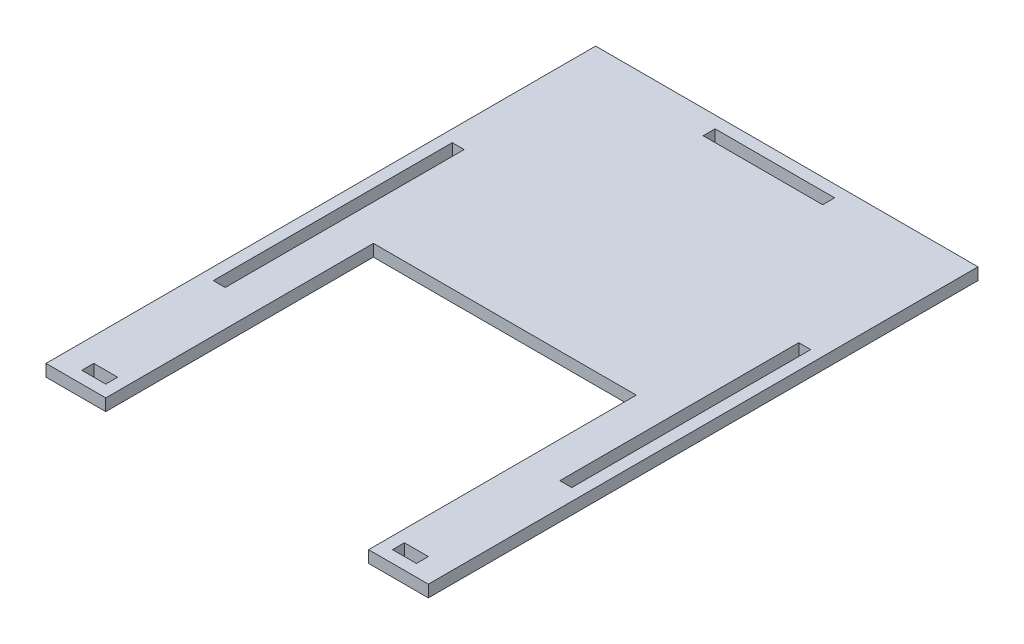
ISO-10303-21;
HEADER;
FILE_DESCRIPTION(('STEP AP214'),'2;1');
FILE_NAME('part.step','',(''),(''),'','','');
FILE_SCHEMA(('AUTOMOTIVE_DESIGN { 1 0 10303 214 1 1 1 1 }'));
ENDSEC;
DATA;
#1=APPLICATION_CONTEXT('core data for automotive mechanical design processes');
#2=APPLICATION_PROTOCOL_DEFINITION('international standard','automotive_design',2000,#1);
#3=PRODUCT_CONTEXT('',#1,'mechanical');
#4=PRODUCT('Part','Part','',(#3));
#5=PRODUCT_RELATED_PRODUCT_CATEGORY('part','',(#4));
#6=PRODUCT_DEFINITION_FORMATION('','',#4);
#7=PRODUCT_DEFINITION_CONTEXT('part definition',#1,'design');
#8=PRODUCT_DEFINITION('design','',#6,#7);
#9=PRODUCT_DEFINITION_SHAPE('','',#8);
#10=(LENGTH_UNIT() NAMED_UNIT(*) SI_UNIT(.MILLI.,.METRE.));
#11=(NAMED_UNIT(*) PLANE_ANGLE_UNIT() SI_UNIT($,.RADIAN.));
#12=(NAMED_UNIT(*) SI_UNIT($,.STERADIAN.) SOLID_ANGLE_UNIT());
#13=UNCERTAINTY_MEASURE_WITH_UNIT(LENGTH_MEASURE(1.E-05),#10,'distance_accuracy_value','');
#14=(GEOMETRIC_REPRESENTATION_CONTEXT(3) GLOBAL_UNCERTAINTY_ASSIGNED_CONTEXT((#13)) GLOBAL_UNIT_ASSIGNED_CONTEXT((#10,
#11,#12)) REPRESENTATION_CONTEXT('',''));
#15=CARTESIAN_POINT('',(0.,0.,0.));
#16=DIRECTION('',(0.,0.,1.));
#17=DIRECTION('',(1.,0.,0.));
#18=AXIS2_PLACEMENT_3D('',#15,#16,#17);
#19=CARTESIAN_POINT('',(0.,3.175,0.));
#20=DIRECTION('',(0.,1.,0.));
#21=DIRECTION('',(0.,0.,1.));
#22=AXIS2_PLACEMENT_3D('',#19,#20,#21);
#23=PLANE('',#22);
#24=DIRECTION('',(-1.,0.,0.));
#25=VECTOR('',#24,1.);
#26=CARTESIAN_POINT('',(-44.4500000000001,3.175,-31.75));
#27=LINE('',#26,#25);
#28=CARTESIAN_POINT('',(-44.4500000000001,3.175,-31.75));
#29=VERTEX_POINT('',#28);
#30=CARTESIAN_POINT('',(-47.6250000000001,3.175,-31.75));
#31=VERTEX_POINT('',#30);
#32=EDGE_CURVE('E269',#29,#31,#27,.T.);
#33=ORIENTED_EDGE('',*,*,#32,.F.);
#34=DIRECTION('',(0.,0.,-1.));
#35=VECTOR('',#34,1.);
#36=CARTESIAN_POINT('',(-44.4500000000001,3.175,-31.75));
#37=LINE('',#36,#35);
#38=CARTESIAN_POINT('',(-44.4500000000001,3.175,31.75));
#39=VERTEX_POINT('',#38);
#40=EDGE_CURVE('E267',#39,#29,#37,.T.);
#41=ORIENTED_EDGE('',*,*,#40,.F.);
#42=DIRECTION('',(1.,0.,0.));
#43=VECTOR('',#42,1.);
#44=CARTESIAN_POINT('',(-44.4500000000001,3.175,31.75));
#45=LINE('',#44,#43);
#46=CARTESIAN_POINT('',(-47.625,3.175,31.75));
#47=VERTEX_POINT('',#46);
#48=EDGE_CURVE('E275',#47,#39,#45,.T.);
#49=ORIENTED_EDGE('',*,*,#48,.F.);
#50=DIRECTION('',(0.,0.,1.));
#51=VECTOR('',#50,1.);
#52=CARTESIAN_POINT('',(-47.6250000000001,3.175,-31.75));
#53=LINE('',#52,#51);
#54=EDGE_CURVE('E272',#31,#47,#53,.T.);
#55=ORIENTED_EDGE('',*,*,#54,.F.);
#56=EDGE_LOOP('',(#33,#41,#49,#55));
#57=FACE_BOUND('',#56,.T.);
#58=DIRECTION('',(1.,0.,0.));
#59=VECTOR('',#58,1.);
#60=CARTESIAN_POINT('',(-44.45,3.175,69.85));
#61=LINE('',#60,#59);
#62=CARTESIAN_POINT('',(-44.45,3.175,69.85));
#63=VERTEX_POINT('',#62);
#64=CARTESIAN_POINT('',(-38.1,3.175,69.85));
#65=VERTEX_POINT('',#64);
#66=EDGE_CURVE('E331',#63,#65,#61,.T.);
#67=ORIENTED_EDGE('',*,*,#66,.F.);
#68=DIRECTION('',(0.,0.,1.));
#69=VECTOR('',#68,1.);
#70=CARTESIAN_POINT('',(-44.45,3.175,66.675));
#71=LINE('',#70,#69);
#72=CARTESIAN_POINT('',(-44.45,3.175,66.675));
#73=VERTEX_POINT('',#72);
#74=EDGE_CURVE('E329',#73,#63,#71,.T.);
#75=ORIENTED_EDGE('',*,*,#74,.F.);
#76=DIRECTION('',(-1.,0.,0.));
#77=VECTOR('',#76,1.);
#78=CARTESIAN_POINT('',(-44.45,3.175,66.675));
#79=LINE('',#78,#77);
#80=CARTESIAN_POINT('',(-38.1,3.175,66.675));
#81=VERTEX_POINT('',#80);
#82=EDGE_CURVE('E337',#81,#73,#79,.T.);
#83=ORIENTED_EDGE('',*,*,#82,.F.);
#84=DIRECTION('',(0.,0.,-1.));
#85=VECTOR('',#84,1.);
#86=CARTESIAN_POINT('',(-38.1,3.175,66.675));
#87=LINE('',#86,#85);
#88=EDGE_CURVE('E334',#65,#81,#87,.T.);
#89=ORIENTED_EDGE('',*,*,#88,.F.);
#90=EDGE_LOOP('',(#67,#75,#83,#89));
#91=FACE_BOUND('',#90,.T.);
#92=DIRECTION('',(0.,0.,1.));
#93=VECTOR('',#92,1.);
#94=CARTESIAN_POINT('',(-50.8,3.175,-73.025));
#95=LINE('',#94,#93);
#96=CARTESIAN_POINT('',(-50.8,3.175,-73.025));
#97=VERTEX_POINT('',#96);
#98=CARTESIAN_POINT('',(-50.8,3.175,73.025));
#99=VERTEX_POINT('',#98);
#100=EDGE_CURVE('E403',#97,#99,#95,.T.);
#101=ORIENTED_EDGE('',*,*,#100,.T.);
#102=DIRECTION('',(1.,0.,0.));
#103=VECTOR('',#102,1.);
#104=CARTESIAN_POINT('',(-50.8,3.175,73.025));
#105=LINE('',#104,#103);
#106=CARTESIAN_POINT('',(-34.925,3.175,73.025));
#107=VERTEX_POINT('',#106);
#108=EDGE_CURVE('E406',#99,#107,#105,.T.);
#109=ORIENTED_EDGE('',*,*,#108,.T.);
#110=DIRECTION('',(0.,0.,-1.));
#111=VECTOR('',#110,1.);
#112=CARTESIAN_POINT('',(-34.925,3.175,73.025));
#113=LINE('',#112,#111);
#114=CARTESIAN_POINT('',(-34.925,3.175,1.90500000000002));
#115=VERTEX_POINT('',#114);
#116=EDGE_CURVE('E409',#107,#115,#113,.T.);
#117=ORIENTED_EDGE('',*,*,#116,.T.);
#118=DIRECTION('',(1.,0.,0.));
#119=VECTOR('',#118,1.);
#120=CARTESIAN_POINT('',(-34.925,3.175,1.90500000000002));
#121=LINE('',#120,#119);
#122=CARTESIAN_POINT('',(34.925,3.175,1.90500000000001));
#123=VERTEX_POINT('',#122);
#124=EDGE_CURVE('E411',#115,#123,#121,.T.);
#125=ORIENTED_EDGE('',*,*,#124,.T.);
#126=DIRECTION('',(0.,0.,1.));
#127=VECTOR('',#126,1.);
#128=CARTESIAN_POINT('',(34.925,3.175,1.90500000000001));
#129=LINE('',#128,#127);
#130=CARTESIAN_POINT('',(34.925,3.175,73.025));
#131=VERTEX_POINT('',#130);
#132=EDGE_CURVE('E413',#123,#131,#129,.T.);
#133=ORIENTED_EDGE('',*,*,#132,.T.);
#134=DIRECTION('',(1.,0.,0.));
#135=VECTOR('',#134,1.);
#136=CARTESIAN_POINT('',(34.925,3.175,73.025));
#137=LINE('',#136,#135);
#138=CARTESIAN_POINT('',(50.8,3.175,73.025));
#139=VERTEX_POINT('',#138);
#140=EDGE_CURVE('E416',#131,#139,#137,.T.);
#141=ORIENTED_EDGE('',*,*,#140,.T.);
#142=DIRECTION('',(0.,0.,-1.));
#143=VECTOR('',#142,1.);
#144=CARTESIAN_POINT('',(50.8,3.175,-73.025));
#145=LINE('',#144,#143);
#146=CARTESIAN_POINT('',(50.8,3.175,-73.025));
#147=VERTEX_POINT('',#146);
#148=EDGE_CURVE('E419',#139,#147,#145,.T.);
#149=ORIENTED_EDGE('',*,*,#148,.T.);
#150=DIRECTION('',(-1.,0.,0.));
#151=VECTOR('',#150,1.);
#152=CARTESIAN_POINT('',(-50.8,3.175,-73.025));
#153=LINE('',#152,#151);
#154=EDGE_CURVE('E421',#147,#97,#153,.T.);
#155=ORIENTED_EDGE('',*,*,#154,.T.);
#156=EDGE_LOOP('',(#101,#109,#117,#125,#133,#141,#149,#155));
#157=FACE_BOUND('',#156,.T.);
#158=DIRECTION('',(-1.,0.,0.));
#159=VECTOR('',#158,1.);
#160=CARTESIAN_POINT('',(38.0999999999999,3.175,66.675));
#161=LINE('',#160,#159);
#162=CARTESIAN_POINT('',(44.4499999999999,3.175,66.675));
#163=VERTEX_POINT('',#162);
#164=CARTESIAN_POINT('',(38.0999999999999,3.175,66.675));
#165=VERTEX_POINT('',#164);
#166=EDGE_CURVE('E363',#163,#165,#161,.T.);
#167=ORIENTED_EDGE('',*,*,#166,.F.);
#168=DIRECTION('',(0.,0.,-1.));
#169=VECTOR('',#168,1.);
#170=CARTESIAN_POINT('',(44.4499999999999,3.175,66.675));
#171=LINE('',#170,#169);
#172=CARTESIAN_POINT('',(44.4499999999999,3.175,69.85));
#173=VERTEX_POINT('',#172);
#174=EDGE_CURVE('E360',#173,#163,#171,.T.);
#175=ORIENTED_EDGE('',*,*,#174,.F.);
#176=DIRECTION('',(1.,0.,0.));
#177=VECTOR('',#176,1.);
#178=CARTESIAN_POINT('',(38.1,3.175,69.85));
#179=LINE('',#178,#177);
#180=CARTESIAN_POINT('',(38.1,3.175,69.85));
#181=VERTEX_POINT('',#180);
#182=EDGE_CURVE('E371',#181,#173,#179,.T.);
#183=ORIENTED_EDGE('',*,*,#182,.F.);
#184=DIRECTION('',(0.,0.,1.));
#185=VECTOR('',#184,1.);
#186=CARTESIAN_POINT('',(38.0999999999999,3.175,66.675));
#187=LINE('',#186,#185);
#188=EDGE_CURVE('E367',#165,#181,#187,.T.);
#189=ORIENTED_EDGE('',*,*,#188,.F.);
#190=EDGE_LOOP('',(#167,#175,#183,#189));
#191=FACE_BOUND('',#190,.T.);
#192=DIRECTION('',(1.,0.,0.));
#193=VECTOR('',#192,1.);
#194=CARTESIAN_POINT('',(-15.875,3.175,-66.675));
#195=LINE('',#194,#193);
#196=CARTESIAN_POINT('',(-15.875,3.175,-66.675));
#197=VERTEX_POINT('',#196);
#198=CARTESIAN_POINT('',(15.875,3.175,-66.675));
#199=VERTEX_POINT('',#198);
#200=EDGE_CURVE('E300',#197,#199,#195,.T.);
#201=ORIENTED_EDGE('',*,*,#200,.F.);
#202=DIRECTION('',(0.,0.,1.));
#203=VECTOR('',#202,1.);
#204=CARTESIAN_POINT('',(-15.875,3.175,-69.85));
#205=LINE('',#204,#203);
#206=CARTESIAN_POINT('',(-15.875,3.175,-69.85));
#207=VERTEX_POINT('',#206);
#208=EDGE_CURVE('E298',#207,#197,#205,.T.);
#209=ORIENTED_EDGE('',*,*,#208,.F.);
#210=DIRECTION('',(-1.,0.,0.));
#211=VECTOR('',#210,1.);
#212=CARTESIAN_POINT('',(-15.875,3.175,-69.85));
#213=LINE('',#212,#211);
#214=CARTESIAN_POINT('',(15.875,3.175,-69.85));
#215=VERTEX_POINT('',#214);
#216=EDGE_CURVE('E306',#215,#207,#213,.T.);
#217=ORIENTED_EDGE('',*,*,#216,.F.);
#218=DIRECTION('',(0.,0.,-1.));
#219=VECTOR('',#218,1.);
#220=CARTESIAN_POINT('',(15.875,3.175,-69.85));
#221=LINE('',#220,#219);
#222=EDGE_CURVE('E303',#199,#215,#221,.T.);
#223=ORIENTED_EDGE('',*,*,#222,.F.);
#224=EDGE_LOOP('',(#201,#209,#217,#223));
#225=FACE_BOUND('',#224,.T.);
#226=DIRECTION('',(1.,0.,0.));
#227=VECTOR('',#226,1.);
#228=CARTESIAN_POINT('',(44.4499999999999,3.175,31.75));
#229=LINE('',#228,#227);
#230=CARTESIAN_POINT('',(44.4499999999999,3.175,31.75));
#231=VERTEX_POINT('',#230);
#232=CARTESIAN_POINT('',(47.625,3.175,31.75));
#233=VERTEX_POINT('',#232);
#234=EDGE_CURVE('E239',#231,#233,#229,.T.);
#235=ORIENTED_EDGE('',*,*,#234,.F.);
#236=DIRECTION('',(0.,0.,1.));
#237=VECTOR('',#236,1.);
#238=CARTESIAN_POINT('',(44.4499999999999,3.175,-31.75));
#239=LINE('',#238,#237);
#240=CARTESIAN_POINT('',(44.4499999999999,3.175,-31.75));
#241=VERTEX_POINT('',#240);
#242=EDGE_CURVE('E231',#241,#231,#239,.T.);
#243=ORIENTED_EDGE('',*,*,#242,.F.);
#244=DIRECTION('',(-1.,0.,0.));
#245=VECTOR('',#244,1.);
#246=CARTESIAN_POINT('',(44.4499999999999,3.175,-31.75));
#247=LINE('',#246,#245);
#248=CARTESIAN_POINT('',(47.625,3.175,-31.75));
#249=VERTEX_POINT('',#248);
#250=EDGE_CURVE('E253',#249,#241,#247,.T.);
#251=ORIENTED_EDGE('',*,*,#250,.F.);
#252=DIRECTION('',(0.,0.,-1.));
#253=VECTOR('',#252,1.);
#254=CARTESIAN_POINT('',(47.625,3.175,-31.75));
#255=LINE('',#254,#253);
#256=EDGE_CURVE('E251',#233,#249,#255,.T.);
#257=ORIENTED_EDGE('',*,*,#256,.F.);
#258=EDGE_LOOP('',(#235,#243,#251,#257));
#259=FACE_BOUND('',#258,.T.);
#260=ADVANCED_FACE('F36',(#57,#91,#157,#191,#225,#259),#23,.T.);
#261=CARTESIAN_POINT('',(0.,0.,0.));
#262=DIRECTION('',(0.,1.,0.));
#263=DIRECTION('',(0.,0.,1.));
#264=AXIS2_PLACEMENT_3D('',#261,#262,#263);
#265=PLANE('',#264);
#266=DIRECTION('',(0.,0.,-1.));
#267=VECTOR('',#266,1.);
#268=CARTESIAN_POINT('',(-44.4500000000001,0.,-31.75));
#269=LINE('',#268,#267);
#270=CARTESIAN_POINT('',(-44.4500000000001,0.,31.75));
#271=VERTEX_POINT('',#270);
#272=CARTESIAN_POINT('',(-44.4500000000001,0.,-31.75));
#273=VERTEX_POINT('',#272);
#274=EDGE_CURVE('E247',#271,#273,#269,.T.);
#275=ORIENTED_EDGE('',*,*,#274,.T.);
#276=DIRECTION('',(-1.,0.,0.));
#277=VECTOR('',#276,1.);
#278=CARTESIAN_POINT('',(-44.4500000000001,0.,-31.75));
#279=LINE('',#278,#277);
#280=CARTESIAN_POINT('',(-47.6250000000001,0.,-31.75));
#281=VERTEX_POINT('',#280);
#282=EDGE_CURVE('E280',#273,#281,#279,.T.);
#283=ORIENTED_EDGE('',*,*,#282,.T.);
#284=DIRECTION('',(0.,0.,1.));
#285=VECTOR('',#284,1.);
#286=CARTESIAN_POINT('',(-47.6250000000001,0.,-31.75));
#287=LINE('',#286,#285);
#288=CARTESIAN_POINT('',(-47.625,0.,31.75));
#289=VERTEX_POINT('',#288);
#290=EDGE_CURVE('E283',#281,#289,#287,.T.);
#291=ORIENTED_EDGE('',*,*,#290,.T.);
#292=DIRECTION('',(1.,0.,0.));
#293=VECTOR('',#292,1.);
#294=CARTESIAN_POINT('',(-44.4500000000001,0.,31.75));
#295=LINE('',#294,#293);
#296=EDGE_CURVE('E270',#289,#271,#295,.T.);
#297=ORIENTED_EDGE('',*,*,#296,.T.);
#298=EDGE_LOOP('',(#275,#283,#291,#297));
#299=FACE_BOUND('',#298,.T.);
#300=DIRECTION('',(0.,0.,1.));
#301=VECTOR('',#300,1.);
#302=CARTESIAN_POINT('',(-44.45,0.,66.675));
#303=LINE('',#302,#301);
#304=CARTESIAN_POINT('',(-44.45,0.,66.675));
#305=VERTEX_POINT('',#304);
#306=CARTESIAN_POINT('',(-44.45,0.,69.85));
#307=VERTEX_POINT('',#306);
#308=EDGE_CURVE('E328',#305,#307,#303,.T.);
#309=ORIENTED_EDGE('',*,*,#308,.T.);
#310=DIRECTION('',(1.,0.,0.));
#311=VECTOR('',#310,1.);
#312=CARTESIAN_POINT('',(-44.45,0.,69.85));
#313=LINE('',#312,#311);
#314=CARTESIAN_POINT('',(-38.1,0.,69.85));
#315=VERTEX_POINT('',#314);
#316=EDGE_CURVE('E342',#307,#315,#313,.T.);
#317=ORIENTED_EDGE('',*,*,#316,.T.);
#318=DIRECTION('',(0.,0.,-1.));
#319=VECTOR('',#318,1.);
#320=CARTESIAN_POINT('',(-38.1,0.,66.675));
#321=LINE('',#320,#319);
#322=CARTESIAN_POINT('',(-38.1,0.,66.675));
#323=VERTEX_POINT('',#322);
#324=EDGE_CURVE('E345',#315,#323,#321,.T.);
#325=ORIENTED_EDGE('',*,*,#324,.T.);
#326=DIRECTION('',(-1.,0.,0.));
#327=VECTOR('',#326,1.);
#328=CARTESIAN_POINT('',(-44.45,0.,66.675));
#329=LINE('',#328,#327);
#330=EDGE_CURVE('E332',#323,#305,#329,.T.);
#331=ORIENTED_EDGE('',*,*,#330,.T.);
#332=EDGE_LOOP('',(#309,#317,#325,#331));
#333=FACE_BOUND('',#332,.T.);
#334=DIRECTION('',(0.,0.,1.));
#335=VECTOR('',#334,1.);
#336=CARTESIAN_POINT('',(-50.8,0.,-73.025));
#337=LINE('',#336,#335);
#338=CARTESIAN_POINT('',(-50.8,0.,-73.025));
#339=VERTEX_POINT('',#338);
#340=CARTESIAN_POINT('',(-50.8,0.,73.025));
#341=VERTEX_POINT('',#340);
#342=EDGE_CURVE('E402',#339,#341,#337,.T.);
#343=ORIENTED_EDGE('',*,*,#342,.F.);
#344=DIRECTION('',(-1.,0.,0.));
#345=VECTOR('',#344,1.);
#346=CARTESIAN_POINT('',(-50.8,0.,-73.025));
#347=LINE('',#346,#345);
#348=CARTESIAN_POINT('',(50.8,0.,-73.025));
#349=VERTEX_POINT('',#348);
#350=EDGE_CURVE('E407',#349,#339,#347,.T.);
#351=ORIENTED_EDGE('',*,*,#350,.F.);
#352=DIRECTION('',(0.,0.,-1.));
#353=VECTOR('',#352,1.);
#354=CARTESIAN_POINT('',(50.8,0.,-73.025));
#355=LINE('',#354,#353);
#356=CARTESIAN_POINT('',(50.8,0.,73.025));
#357=VERTEX_POINT('',#356);
#358=EDGE_CURVE('E438',#357,#349,#355,.T.);
#359=ORIENTED_EDGE('',*,*,#358,.F.);
#360=DIRECTION('',(1.,0.,0.));
#361=VECTOR('',#360,1.);
#362=CARTESIAN_POINT('',(34.925,0.,73.025));
#363=LINE('',#362,#361);
#364=CARTESIAN_POINT('',(34.925,0.,73.025));
#365=VERTEX_POINT('',#364);
#366=EDGE_CURVE('E435',#365,#357,#363,.T.);
#367=ORIENTED_EDGE('',*,*,#366,.F.);
#368=DIRECTION('',(0.,0.,1.));
#369=VECTOR('',#368,1.);
#370=CARTESIAN_POINT('',(34.925,0.,1.90500000000001));
#371=LINE('',#370,#369);
#372=CARTESIAN_POINT('',(34.925,0.,1.90500000000001));
#373=VERTEX_POINT('',#372);
#374=EDGE_CURVE('E432',#373,#365,#371,.T.);
#375=ORIENTED_EDGE('',*,*,#374,.F.);
#376=DIRECTION('',(1.,0.,0.));
#377=VECTOR('',#376,1.);
#378=CARTESIAN_POINT('',(-34.925,0.,1.90500000000002));
#379=LINE('',#378,#377);
#380=CARTESIAN_POINT('',(-34.925,0.,1.90500000000002));
#381=VERTEX_POINT('',#380);
#382=EDGE_CURVE('E430',#381,#373,#379,.T.);
#383=ORIENTED_EDGE('',*,*,#382,.F.);
#384=DIRECTION('',(0.,0.,-1.));
#385=VECTOR('',#384,1.);
#386=CARTESIAN_POINT('',(-34.925,0.,73.025));
#387=LINE('',#386,#385);
#388=CARTESIAN_POINT('',(-34.925,0.,73.025));
#389=VERTEX_POINT('',#388);
#390=EDGE_CURVE('E428',#389,#381,#387,.T.);
#391=ORIENTED_EDGE('',*,*,#390,.F.);
#392=DIRECTION('',(1.,0.,0.));
#393=VECTOR('',#392,1.);
#394=CARTESIAN_POINT('',(-50.8,0.,73.025));
#395=LINE('',#394,#393);
#396=EDGE_CURVE('E426',#341,#389,#395,.T.);
#397=ORIENTED_EDGE('',*,*,#396,.F.);
#398=EDGE_LOOP('',(#343,#351,#359,#367,#375,#383,#391,#397));
#399=FACE_BOUND('',#398,.T.);
#400=DIRECTION('',(0.,0.,-1.));
#401=VECTOR('',#400,1.);
#402=CARTESIAN_POINT('',(44.4499999999999,0.,66.675));
#403=LINE('',#402,#401);
#404=CARTESIAN_POINT('',(44.4499999999999,0.,69.85));
#405=VERTEX_POINT('',#404);
#406=CARTESIAN_POINT('',(44.4499999999999,0.,66.675));
#407=VERTEX_POINT('',#406);
#408=EDGE_CURVE('E359',#405,#407,#403,.T.);
#409=ORIENTED_EDGE('',*,*,#408,.T.);
#410=DIRECTION('',(-1.,0.,0.));
#411=VECTOR('',#410,1.);
#412=CARTESIAN_POINT('',(38.0999999999999,0.,66.675));
#413=LINE('',#412,#411);
#414=CARTESIAN_POINT('',(38.0999999999999,0.,66.675));
#415=VERTEX_POINT('',#414);
#416=EDGE_CURVE('E378',#407,#415,#413,.T.);
#417=ORIENTED_EDGE('',*,*,#416,.T.);
#418=DIRECTION('',(0.,0.,1.));
#419=VECTOR('',#418,1.);
#420=CARTESIAN_POINT('',(38.0999999999999,0.,66.675));
#421=LINE('',#420,#419);
#422=CARTESIAN_POINT('',(38.1,0.,69.85));
#423=VERTEX_POINT('',#422);
#424=EDGE_CURVE('E382',#415,#423,#421,.T.);
#425=ORIENTED_EDGE('',*,*,#424,.T.);
#426=DIRECTION('',(1.,0.,0.));
#427=VECTOR('',#426,1.);
#428=CARTESIAN_POINT('',(38.1,0.,69.85));
#429=LINE('',#428,#427);
#430=EDGE_CURVE('E364',#423,#405,#429,.T.);
#431=ORIENTED_EDGE('',*,*,#430,.T.);
#432=EDGE_LOOP('',(#409,#417,#425,#431));
#433=FACE_BOUND('',#432,.T.);
#434=DIRECTION('',(0.,0.,1.));
#435=VECTOR('',#434,1.);
#436=CARTESIAN_POINT('',(-15.875,0.,-69.85));
#437=LINE('',#436,#435);
#438=CARTESIAN_POINT('',(-15.875,0.,-69.85));
#439=VERTEX_POINT('',#438);
#440=CARTESIAN_POINT('',(-15.875,0.,-66.675));
#441=VERTEX_POINT('',#440);
#442=EDGE_CURVE('E297',#439,#441,#437,.T.);
#443=ORIENTED_EDGE('',*,*,#442,.T.);
#444=DIRECTION('',(1.,0.,0.));
#445=VECTOR('',#444,1.);
#446=CARTESIAN_POINT('',(-15.875,0.,-66.675));
#447=LINE('',#446,#445);
#448=CARTESIAN_POINT('',(15.875,0.,-66.675));
#449=VERTEX_POINT('',#448);
#450=EDGE_CURVE('E311',#441,#449,#447,.T.);
#451=ORIENTED_EDGE('',*,*,#450,.T.);
#452=DIRECTION('',(0.,0.,-1.));
#453=VECTOR('',#452,1.);
#454=CARTESIAN_POINT('',(15.875,0.,-69.85));
#455=LINE('',#454,#453);
#456=CARTESIAN_POINT('',(15.875,0.,-69.85));
#457=VERTEX_POINT('',#456);
#458=EDGE_CURVE('E314',#449,#457,#455,.T.);
#459=ORIENTED_EDGE('',*,*,#458,.T.);
#460=DIRECTION('',(-1.,0.,0.));
#461=VECTOR('',#460,1.);
#462=CARTESIAN_POINT('',(-15.875,0.,-69.85));
#463=LINE('',#462,#461);
#464=EDGE_CURVE('E301',#457,#439,#463,.T.);
#465=ORIENTED_EDGE('',*,*,#464,.T.);
#466=EDGE_LOOP('',(#443,#451,#459,#465));
#467=FACE_BOUND('',#466,.T.);
#468=DIRECTION('',(0.,0.,1.));
#469=VECTOR('',#468,1.);
#470=CARTESIAN_POINT('',(44.4499999999999,0.,-31.75));
#471=LINE('',#470,#469);
#472=CARTESIAN_POINT('',(44.4499999999999,0.,-31.75));
#473=VERTEX_POINT('',#472);
#474=CARTESIAN_POINT('',(44.4499999999999,0.,31.75));
#475=VERTEX_POINT('',#474);
#476=EDGE_CURVE('E59',#473,#475,#471,.T.);
#477=ORIENTED_EDGE('',*,*,#476,.T.);
#478=DIRECTION('',(1.,0.,0.));
#479=VECTOR('',#478,1.);
#480=CARTESIAN_POINT('',(44.4499999999999,0.,31.75));
#481=LINE('',#480,#479);
#482=CARTESIAN_POINT('',(47.625,0.,31.75));
#483=VERTEX_POINT('',#482);
#484=EDGE_CURVE('E246',#475,#483,#481,.T.);
#485=ORIENTED_EDGE('',*,*,#484,.T.);
#486=DIRECTION('',(0.,0.,-1.));
#487=VECTOR('',#486,1.);
#488=CARTESIAN_POINT('',(47.625,0.,-31.75));
#489=LINE('',#488,#487);
#490=CARTESIAN_POINT('',(47.625,0.,-31.75));
#491=VERTEX_POINT('',#490);
#492=EDGE_CURVE('E259',#483,#491,#489,.T.);
#493=ORIENTED_EDGE('',*,*,#492,.T.);
#494=DIRECTION('',(-1.,0.,0.));
#495=VECTOR('',#494,1.);
#496=CARTESIAN_POINT('',(44.4499999999999,0.,-31.75));
#497=LINE('',#496,#495);
#498=EDGE_CURVE('E240',#491,#473,#497,.T.);
#499=ORIENTED_EDGE('',*,*,#498,.T.);
#500=EDGE_LOOP('',(#477,#485,#493,#499));
#501=FACE_BOUND('',#500,.T.);
#502=ADVANCED_FACE('F469',(#299,#333,#399,#433,#467,#501),#265,.F.);
#503=CARTESIAN_POINT('',(-50.8,3.175,-73.025));
#504=DIRECTION('',(1.,0.,0.));
#505=DIRECTION('',(0.,0.,-1.));
#506=AXIS2_PLACEMENT_3D('',#503,#504,#505);
#507=PLANE('',#506);
#508=ORIENTED_EDGE('',*,*,#342,.T.);
#509=DIRECTION('',(0.,-1.,0.));
#510=VECTOR('',#509,1.);
#511=CARTESIAN_POINT('',(-50.8,3.175,73.025));
#512=LINE('',#511,#510);
#513=EDGE_CURVE('E11',#99,#341,#512,.T.);
#514=ORIENTED_EDGE('',*,*,#513,.F.);
#515=ORIENTED_EDGE('',*,*,#100,.F.);
#516=DIRECTION('',(0.,-1.,0.));
#517=VECTOR('',#516,1.);
#518=CARTESIAN_POINT('',(-50.8,3.175,-73.025));
#519=LINE('',#518,#517);
#520=EDGE_CURVE('E423',#97,#339,#519,.T.);
#521=ORIENTED_EDGE('',*,*,#520,.T.);
#522=EDGE_LOOP('',(#508,#514,#515,#521));
#523=FACE_BOUND('',#522,.T.);
#524=ADVANCED_FACE('F38',(#523),#507,.F.);
#525=CARTESIAN_POINT('',(-50.8,3.175,73.025));
#526=DIRECTION('',(0.,0.,-1.));
#527=DIRECTION('',(-1.,0.,0.));
#528=AXIS2_PLACEMENT_3D('',#525,#526,#527);
#529=PLANE('',#528);
#530=ORIENTED_EDGE('',*,*,#396,.T.);
#531=DIRECTION('',(0.,-1.,0.));
#532=VECTOR('',#531,1.);
#533=CARTESIAN_POINT('',(-34.925,3.175,73.025));
#534=LINE('',#533,#532);
#535=EDGE_CURVE('E44',#107,#389,#534,.T.);
#536=ORIENTED_EDGE('',*,*,#535,.F.);
#537=ORIENTED_EDGE('',*,*,#108,.F.);
#538=ORIENTED_EDGE('',*,*,#513,.T.);
#539=EDGE_LOOP('',(#530,#536,#537,#538));
#540=FACE_BOUND('',#539,.T.);
#541=ADVANCED_FACE('F487',(#540),#529,.F.);
#542=CARTESIAN_POINT('',(-34.925,3.175,73.025));
#543=DIRECTION('',(-1.,0.,0.));
#544=DIRECTION('',(0.,0.,1.));
#545=AXIS2_PLACEMENT_3D('',#542,#543,#544);
#546=PLANE('',#545);
#547=ORIENTED_EDGE('',*,*,#390,.T.);
#548=DIRECTION('',(0.,-1.,0.));
#549=VECTOR('',#548,1.);
#550=CARTESIAN_POINT('',(-34.925,3.175,1.90500000000002));
#551=LINE('',#550,#549);
#552=EDGE_CURVE('E456',#115,#381,#551,.T.);
#553=ORIENTED_EDGE('',*,*,#552,.F.);
#554=ORIENTED_EDGE('',*,*,#116,.F.);
#555=ORIENTED_EDGE('',*,*,#535,.T.);
#556=EDGE_LOOP('',(#547,#553,#554,#555));
#557=FACE_BOUND('',#556,.T.);
#558=ADVANCED_FACE('F463',(#557),#546,.F.);
#559=CARTESIAN_POINT('',(-34.925,3.175,1.90500000000002));
#560=DIRECTION('',(0.,0.,-1.));
#561=DIRECTION('',(-1.,0.,0.));
#562=AXIS2_PLACEMENT_3D('',#559,#560,#561);
#563=PLANE('',#562);
#564=ORIENTED_EDGE('',*,*,#382,.T.);
#565=DIRECTION('',(0.,-1.,0.));
#566=VECTOR('',#565,1.);
#567=CARTESIAN_POINT('',(34.925,3.175,1.90500000000001));
#568=LINE('',#567,#566);
#569=EDGE_CURVE('E453',#123,#373,#568,.T.);
#570=ORIENTED_EDGE('',*,*,#569,.F.);
#571=ORIENTED_EDGE('',*,*,#124,.F.);
#572=ORIENTED_EDGE('',*,*,#552,.T.);
#573=EDGE_LOOP('',(#564,#570,#571,#572));
#574=FACE_BOUND('',#573,.T.);
#575=ADVANCED_FACE('F475',(#574),#563,.F.);
#576=CARTESIAN_POINT('',(34.925,3.175,1.90500000000001));
#577=DIRECTION('',(1.,0.,0.));
#578=DIRECTION('',(0.,0.,-1.));
#579=AXIS2_PLACEMENT_3D('',#576,#577,#578);
#580=PLANE('',#579);
#581=ORIENTED_EDGE('',*,*,#374,.T.);
#582=DIRECTION('',(0.,-1.,0.));
#583=VECTOR('',#582,1.);
#584=CARTESIAN_POINT('',(34.925,3.175,73.025));
#585=LINE('',#584,#583);
#586=EDGE_CURVE('E449',#131,#365,#585,.T.);
#587=ORIENTED_EDGE('',*,*,#586,.F.);
#588=ORIENTED_EDGE('',*,*,#132,.F.);
#589=ORIENTED_EDGE('',*,*,#569,.T.);
#590=EDGE_LOOP('',(#581,#587,#588,#589));
#591=FACE_BOUND('',#590,.T.);
#592=ADVANCED_FACE('F479',(#591),#580,.F.);
#593=CARTESIAN_POINT('',(34.925,3.175,73.025));
#594=DIRECTION('',(0.,0.,-1.));
#595=DIRECTION('',(-1.,0.,0.));
#596=AXIS2_PLACEMENT_3D('',#593,#594,#595);
#597=PLANE('',#596);
#598=ORIENTED_EDGE('',*,*,#366,.T.);
#599=DIRECTION('',(0.,-1.,0.));
#600=VECTOR('',#599,1.);
#601=CARTESIAN_POINT('',(50.8,3.175,73.025));
#602=LINE('',#601,#600);
#603=EDGE_CURVE('E446',#139,#357,#602,.T.);
#604=ORIENTED_EDGE('',*,*,#603,.F.);
#605=ORIENTED_EDGE('',*,*,#140,.F.);
#606=ORIENTED_EDGE('',*,*,#586,.T.);
#607=EDGE_LOOP('',(#598,#604,#605,#606));
#608=FACE_BOUND('',#607,.T.);
#609=ADVANCED_FACE('F500',(#608),#597,.F.);
#610=CARTESIAN_POINT('',(50.8,3.175,-73.025));
#611=DIRECTION('',(-1.,0.,0.));
#612=DIRECTION('',(0.,0.,1.));
#613=AXIS2_PLACEMENT_3D('',#610,#611,#612);
#614=PLANE('',#613);
#615=ORIENTED_EDGE('',*,*,#358,.T.);
#616=DIRECTION('',(0.,-1.,0.));
#617=VECTOR('',#616,1.);
#618=CARTESIAN_POINT('',(50.8,3.175,-73.025));
#619=LINE('',#618,#617);
#620=EDGE_CURVE('E443',#147,#349,#619,.T.);
#621=ORIENTED_EDGE('',*,*,#620,.F.);
#622=ORIENTED_EDGE('',*,*,#148,.F.);
#623=ORIENTED_EDGE('',*,*,#603,.T.);
#624=EDGE_LOOP('',(#615,#621,#622,#623));
#625=FACE_BOUND('',#624,.T.);
#626=ADVANCED_FACE('F498',(#625),#614,.F.);
#627=CARTESIAN_POINT('',(-50.8,3.175,-73.025));
#628=DIRECTION('',(0.,0.,1.));
#629=DIRECTION('',(1.,0.,0.));
#630=AXIS2_PLACEMENT_3D('',#627,#628,#629);
#631=PLANE('',#630);
#632=ORIENTED_EDGE('',*,*,#350,.T.);
#633=ORIENTED_EDGE('',*,*,#520,.F.);
#634=ORIENTED_EDGE('',*,*,#154,.F.);
#635=ORIENTED_EDGE('',*,*,#620,.T.);
#636=EDGE_LOOP('',(#632,#633,#634,#635));
#637=FACE_BOUND('',#636,.T.);
#638=ADVANCED_FACE('F493',(#637),#631,.F.);
#639=CARTESIAN_POINT('',(44.4499999999999,3.175,66.675));
#640=DIRECTION('',(-1.,0.,0.));
#641=DIRECTION('',(0.,0.,1.));
#642=AXIS2_PLACEMENT_3D('',#639,#640,#641);
#643=PLANE('',#642);
#644=ORIENTED_EDGE('',*,*,#408,.F.);
#645=DIRECTION('',(0.,-1.,0.));
#646=VECTOR('',#645,1.);
#647=CARTESIAN_POINT('',(44.4499999999999,3.175,69.85));
#648=LINE('',#647,#646);
#649=EDGE_CURVE('E374',#173,#405,#648,.T.);
#650=ORIENTED_EDGE('',*,*,#649,.F.);
#651=ORIENTED_EDGE('',*,*,#174,.T.);
#652=DIRECTION('',(0.,-1.,0.));
#653=VECTOR('',#652,1.);
#654=CARTESIAN_POINT('',(44.4499999999999,3.175,66.675));
#655=LINE('',#654,#653);
#656=EDGE_CURVE('E398',#163,#407,#655,.T.);
#657=ORIENTED_EDGE('',*,*,#656,.T.);
#658=EDGE_LOOP('',(#644,#650,#651,#657));
#659=FACE_BOUND('',#658,.T.);
#660=ADVANCED_FACE('F520',(#659),#643,.T.);
#661=CARTESIAN_POINT('',(38.0999999999999,3.175,66.675));
#662=DIRECTION('',(0.,0.,1.));
#663=DIRECTION('',(1.,0.,0.));
#664=AXIS2_PLACEMENT_3D('',#661,#662,#663);
#665=PLANE('',#664);
#666=ORIENTED_EDGE('',*,*,#416,.F.);
#667=ORIENTED_EDGE('',*,*,#656,.F.);
#668=ORIENTED_EDGE('',*,*,#166,.T.);
#669=DIRECTION('',(0.,-1.,0.));
#670=VECTOR('',#669,1.);
#671=CARTESIAN_POINT('',(38.0999999999999,3.175,66.675));
#672=LINE('',#671,#670);
#673=EDGE_CURVE('E395',#165,#415,#672,.T.);
#674=ORIENTED_EDGE('',*,*,#673,.T.);
#675=EDGE_LOOP('',(#666,#667,#668,#674));
#676=FACE_BOUND('',#675,.T.);
#677=ADVANCED_FACE('F527',(#676),#665,.T.);
#678=CARTESIAN_POINT('',(38.0999999999999,3.175,66.675));
#679=DIRECTION('',(1.,0.,0.));
#680=DIRECTION('',(0.,0.,-1.));
#681=AXIS2_PLACEMENT_3D('',#678,#679,#680);
#682=PLANE('',#681);
#683=ORIENTED_EDGE('',*,*,#424,.F.);
#684=ORIENTED_EDGE('',*,*,#673,.F.);
#685=ORIENTED_EDGE('',*,*,#188,.T.);
#686=DIRECTION('',(0.,-1.,0.));
#687=VECTOR('',#686,1.);
#688=CARTESIAN_POINT('',(38.1,3.175,69.85));
#689=LINE('',#688,#687);
#690=EDGE_CURVE('E392',#181,#423,#689,.T.);
#691=ORIENTED_EDGE('',*,*,#690,.T.);
#692=EDGE_LOOP('',(#683,#684,#685,#691));
#693=FACE_BOUND('',#692,.T.);
#694=ADVANCED_FACE('F532',(#693),#682,.T.);
#695=CARTESIAN_POINT('',(38.1,3.175,69.85));
#696=DIRECTION('',(0.,0.,-1.));
#697=DIRECTION('',(-1.,0.,0.));
#698=AXIS2_PLACEMENT_3D('',#695,#696,#697);
#699=PLANE('',#698);
#700=ORIENTED_EDGE('',*,*,#430,.F.);
#701=ORIENTED_EDGE('',*,*,#690,.F.);
#702=ORIENTED_EDGE('',*,*,#182,.T.);
#703=ORIENTED_EDGE('',*,*,#649,.T.);
#704=EDGE_LOOP('',(#700,#701,#702,#703));
#705=FACE_BOUND('',#704,.T.);
#706=ADVANCED_FACE('F539',(#705),#699,.T.);
#707=CARTESIAN_POINT('',(-44.45,3.175,66.675));
#708=DIRECTION('',(1.,0.,0.));
#709=DIRECTION('',(0.,0.,-1.));
#710=AXIS2_PLACEMENT_3D('',#707,#708,#709);
#711=PLANE('',#710);
#712=ORIENTED_EDGE('',*,*,#308,.F.);
#713=DIRECTION('',(0.,-1.,0.));
#714=VECTOR('',#713,1.);
#715=CARTESIAN_POINT('',(-44.45,3.175,66.675));
#716=LINE('',#715,#714);
#717=EDGE_CURVE('E339',#73,#305,#716,.T.);
#718=ORIENTED_EDGE('',*,*,#717,.F.);
#719=ORIENTED_EDGE('',*,*,#74,.T.);
#720=DIRECTION('',(0.,-1.,0.));
#721=VECTOR('',#720,1.);
#722=CARTESIAN_POINT('',(-44.45,3.175,69.85));
#723=LINE('',#722,#721);
#724=EDGE_CURVE('E356',#63,#307,#723,.T.);
#725=ORIENTED_EDGE('',*,*,#724,.T.);
#726=EDGE_LOOP('',(#712,#718,#719,#725));
#727=FACE_BOUND('',#726,.T.);
#728=ADVANCED_FACE('F594',(#727),#711,.T.);
#729=CARTESIAN_POINT('',(-44.45,3.175,69.85));
#730=DIRECTION('',(0.,0.,-1.));
#731=DIRECTION('',(-1.,0.,0.));
#732=AXIS2_PLACEMENT_3D('',#729,#730,#731);
#733=PLANE('',#732);
#734=ORIENTED_EDGE('',*,*,#316,.F.);
#735=ORIENTED_EDGE('',*,*,#724,.F.);
#736=ORIENTED_EDGE('',*,*,#66,.T.);
#737=DIRECTION('',(0.,-1.,0.));
#738=VECTOR('',#737,1.);
#739=CARTESIAN_POINT('',(-38.1,3.175,69.85));
#740=LINE('',#739,#738);
#741=EDGE_CURVE('E354',#65,#315,#740,.T.);
#742=ORIENTED_EDGE('',*,*,#741,.T.);
#743=EDGE_LOOP('',(#734,#735,#736,#742));
#744=FACE_BOUND('',#743,.T.);
#745=ADVANCED_FACE('F590',(#744),#733,.T.);
#746=CARTESIAN_POINT('',(-38.1,3.175,66.675));
#747=DIRECTION('',(-1.,0.,0.));
#748=DIRECTION('',(0.,0.,1.));
#749=AXIS2_PLACEMENT_3D('',#746,#747,#748);
#750=PLANE('',#749);
#751=ORIENTED_EDGE('',*,*,#324,.F.);
#752=ORIENTED_EDGE('',*,*,#741,.F.);
#753=ORIENTED_EDGE('',*,*,#88,.T.);
#754=DIRECTION('',(0.,-1.,0.));
#755=VECTOR('',#754,1.);
#756=CARTESIAN_POINT('',(-38.1,3.175,66.675));
#757=LINE('',#756,#755);
#758=EDGE_CURVE('E352',#81,#323,#757,.T.);
#759=ORIENTED_EDGE('',*,*,#758,.T.);
#760=EDGE_LOOP('',(#751,#752,#753,#759));
#761=FACE_BOUND('',#760,.T.);
#762=ADVANCED_FACE('F586',(#761),#750,.T.);
#763=CARTESIAN_POINT('',(-44.45,3.175,66.675));
#764=DIRECTION('',(0.,0.,1.));
#765=DIRECTION('',(1.,0.,0.));
#766=AXIS2_PLACEMENT_3D('',#763,#764,#765);
#767=PLANE('',#766);
#768=ORIENTED_EDGE('',*,*,#330,.F.);
#769=ORIENTED_EDGE('',*,*,#758,.F.);
#770=ORIENTED_EDGE('',*,*,#82,.T.);
#771=ORIENTED_EDGE('',*,*,#717,.T.);
#772=EDGE_LOOP('',(#768,#769,#770,#771));
#773=FACE_BOUND('',#772,.T.);
#774=ADVANCED_FACE('F583',(#773),#767,.T.);
#775=CARTESIAN_POINT('',(-15.875,3.175,-69.85));
#776=DIRECTION('',(1.,0.,0.));
#777=DIRECTION('',(0.,0.,-1.));
#778=AXIS2_PLACEMENT_3D('',#775,#776,#777);
#779=PLANE('',#778);
#780=ORIENTED_EDGE('',*,*,#442,.F.);
#781=DIRECTION('',(0.,-1.,0.));
#782=VECTOR('',#781,1.);
#783=CARTESIAN_POINT('',(-15.875,3.175,-69.85));
#784=LINE('',#783,#782);
#785=EDGE_CURVE('E308',#207,#439,#784,.T.);
#786=ORIENTED_EDGE('',*,*,#785,.F.);
#787=ORIENTED_EDGE('',*,*,#208,.T.);
#788=DIRECTION('',(0.,-1.,0.));
#789=VECTOR('',#788,1.);
#790=CARTESIAN_POINT('',(-15.875,3.175,-66.675));
#791=LINE('',#790,#789);
#792=EDGE_CURVE('E325',#197,#441,#791,.T.);
#793=ORIENTED_EDGE('',*,*,#792,.T.);
#794=EDGE_LOOP('',(#780,#786,#787,#793));
#795=FACE_BOUND('',#794,.T.);
#796=ADVANCED_FACE('F562',(#795),#779,.T.);
#797=CARTESIAN_POINT('',(-15.875,3.175,-66.675));
#798=DIRECTION('',(0.,0.,-1.));
#799=DIRECTION('',(-1.,0.,0.));
#800=AXIS2_PLACEMENT_3D('',#797,#798,#799);
#801=PLANE('',#800);
#802=ORIENTED_EDGE('',*,*,#450,.F.);
#803=ORIENTED_EDGE('',*,*,#792,.F.);
#804=ORIENTED_EDGE('',*,*,#200,.T.);
#805=DIRECTION('',(0.,-1.,0.));
#806=VECTOR('',#805,1.);
#807=CARTESIAN_POINT('',(15.875,3.175,-66.675));
#808=LINE('',#807,#806);
#809=EDGE_CURVE('E323',#199,#449,#808,.T.);
#810=ORIENTED_EDGE('',*,*,#809,.T.);
#811=EDGE_LOOP('',(#802,#803,#804,#810));
#812=FACE_BOUND('',#811,.T.);
#813=ADVANCED_FACE('F555',(#812),#801,.T.);
#814=CARTESIAN_POINT('',(15.875,3.175,-69.85));
#815=DIRECTION('',(-1.,0.,0.));
#816=DIRECTION('',(0.,0.,1.));
#817=AXIS2_PLACEMENT_3D('',#814,#815,#816);
#818=PLANE('',#817);
#819=ORIENTED_EDGE('',*,*,#458,.F.);
#820=ORIENTED_EDGE('',*,*,#809,.F.);
#821=ORIENTED_EDGE('',*,*,#222,.T.);
#822=DIRECTION('',(0.,-1.,0.));
#823=VECTOR('',#822,1.);
#824=CARTESIAN_POINT('',(15.875,3.175,-69.85));
#825=LINE('',#824,#823);
#826=EDGE_CURVE('E321',#215,#457,#825,.T.);
#827=ORIENTED_EDGE('',*,*,#826,.T.);
#828=EDGE_LOOP('',(#819,#820,#821,#827));
#829=FACE_BOUND('',#828,.T.);
#830=ADVANCED_FACE('F558',(#829),#818,.T.);
#831=CARTESIAN_POINT('',(-15.875,3.175,-69.85));
#832=DIRECTION('',(0.,0.,1.));
#833=DIRECTION('',(1.,0.,0.));
#834=AXIS2_PLACEMENT_3D('',#831,#832,#833);
#835=PLANE('',#834);
#836=ORIENTED_EDGE('',*,*,#464,.F.);
#837=ORIENTED_EDGE('',*,*,#826,.F.);
#838=ORIENTED_EDGE('',*,*,#216,.T.);
#839=ORIENTED_EDGE('',*,*,#785,.T.);
#840=EDGE_LOOP('',(#836,#837,#838,#839));
#841=FACE_BOUND('',#840,.T.);
#842=ADVANCED_FACE('F565',(#841),#835,.T.);
#843=CARTESIAN_POINT('',(-44.4500000000001,3.175,-31.75));
#844=DIRECTION('',(-1.,0.,0.));
#845=DIRECTION('',(0.,0.,1.));
#846=AXIS2_PLACEMENT_3D('',#843,#844,#845);
#847=PLANE('',#846);
#848=ORIENTED_EDGE('',*,*,#274,.F.);
#849=DIRECTION('',(0.,-1.,0.));
#850=VECTOR('',#849,1.);
#851=CARTESIAN_POINT('',(-44.4500000000001,3.175,31.75));
#852=LINE('',#851,#850);
#853=EDGE_CURVE('E277',#39,#271,#852,.T.);
#854=ORIENTED_EDGE('',*,*,#853,.F.);
#855=ORIENTED_EDGE('',*,*,#40,.T.);
#856=DIRECTION('',(0.,-1.,0.));
#857=VECTOR('',#856,1.);
#858=CARTESIAN_POINT('',(-44.4500000000001,3.175,-31.75));
#859=LINE('',#858,#857);
#860=EDGE_CURVE('E294',#29,#273,#859,.T.);
#861=ORIENTED_EDGE('',*,*,#860,.T.);
#862=EDGE_LOOP('',(#848,#854,#855,#861));
#863=FACE_BOUND('',#862,.T.);
#864=ADVANCED_FACE('F567',(#863),#847,.T.);
#865=CARTESIAN_POINT('',(-44.4500000000001,3.175,-31.75));
#866=DIRECTION('',(0.,0.,1.));
#867=DIRECTION('',(1.,0.,0.));
#868=AXIS2_PLACEMENT_3D('',#865,#866,#867);
#869=PLANE('',#868);
#870=ORIENTED_EDGE('',*,*,#282,.F.);
#871=ORIENTED_EDGE('',*,*,#860,.F.);
#872=ORIENTED_EDGE('',*,*,#32,.T.);
#873=DIRECTION('',(0.,-1.,0.));
#874=VECTOR('',#873,1.);
#875=CARTESIAN_POINT('',(-47.6250000000001,3.175,-31.75));
#876=LINE('',#875,#874);
#877=EDGE_CURVE('E292',#31,#281,#876,.T.);
#878=ORIENTED_EDGE('',*,*,#877,.T.);
#879=EDGE_LOOP('',(#870,#871,#872,#878));
#880=FACE_BOUND('',#879,.T.);
#881=ADVANCED_FACE('F573',(#880),#869,.T.);
#882=CARTESIAN_POINT('',(-47.6250000000001,3.175,-31.75));
#883=DIRECTION('',(1.,0.,0.));
#884=DIRECTION('',(0.,0.,-1.));
#885=AXIS2_PLACEMENT_3D('',#882,#883,#884);
#886=PLANE('',#885);
#887=ORIENTED_EDGE('',*,*,#290,.F.);
#888=ORIENTED_EDGE('',*,*,#877,.F.);
#889=ORIENTED_EDGE('',*,*,#54,.T.);
#890=DIRECTION('',(0.,-1.,0.));
#891=VECTOR('',#890,1.);
#892=CARTESIAN_POINT('',(-47.625,3.175,31.75));
#893=LINE('',#892,#891);
#894=EDGE_CURVE('E290',#47,#289,#893,.T.);
#895=ORIENTED_EDGE('',*,*,#894,.T.);
#896=EDGE_LOOP('',(#887,#888,#889,#895));
#897=FACE_BOUND('',#896,.T.);
#898=ADVANCED_FACE('F657',(#897),#886,.T.);
#899=CARTESIAN_POINT('',(-44.4500000000001,3.175,31.75));
#900=DIRECTION('',(0.,0.,-1.));
#901=DIRECTION('',(-1.,0.,0.));
#902=AXIS2_PLACEMENT_3D('',#899,#900,#901);
#903=PLANE('',#902);
#904=ORIENTED_EDGE('',*,*,#296,.F.);
#905=ORIENTED_EDGE('',*,*,#894,.F.);
#906=ORIENTED_EDGE('',*,*,#48,.T.);
#907=ORIENTED_EDGE('',*,*,#853,.T.);
#908=EDGE_LOOP('',(#904,#905,#906,#907));
#909=FACE_BOUND('',#908,.T.);
#910=ADVANCED_FACE('F666',(#909),#903,.T.);
#911=CARTESIAN_POINT('',(44.4499999999999,3.175,-31.75));
#912=DIRECTION('',(1.,0.,0.));
#913=DIRECTION('',(0.,0.,-1.));
#914=AXIS2_PLACEMENT_3D('',#911,#912,#913);
#915=PLANE('',#914);
#916=ORIENTED_EDGE('',*,*,#476,.F.);
#917=DIRECTION('',(0.,-1.,0.));
#918=VECTOR('',#917,1.);
#919=CARTESIAN_POINT('',(44.4499999999999,3.175,-31.75));
#920=LINE('',#919,#918);
#921=EDGE_CURVE('E235',#241,#473,#920,.T.);
#922=ORIENTED_EDGE('',*,*,#921,.F.);
#923=ORIENTED_EDGE('',*,*,#242,.T.);
#924=DIRECTION('',(0.,-1.,0.));
#925=VECTOR('',#924,1.);
#926=CARTESIAN_POINT('',(44.4499999999999,3.175,31.75));
#927=LINE('',#926,#925);
#928=EDGE_CURVE('E234',#231,#475,#927,.T.);
#929=ORIENTED_EDGE('',*,*,#928,.T.);
#930=EDGE_LOOP('',(#916,#922,#923,#929));
#931=FACE_BOUND('',#930,.T.);
#932=ADVANCED_FACE('F233',(#931),#915,.T.);
#933=CARTESIAN_POINT('',(44.4499999999999,3.175,31.75));
#934=DIRECTION('',(0.,0.,-1.));
#935=DIRECTION('',(-1.,0.,0.));
#936=AXIS2_PLACEMENT_3D('',#933,#934,#935);
#937=PLANE('',#936);
#938=ORIENTED_EDGE('',*,*,#484,.F.);
#939=ORIENTED_EDGE('',*,*,#928,.F.);
#940=ORIENTED_EDGE('',*,*,#234,.T.);
#941=DIRECTION('',(0.,-1.,0.));
#942=VECTOR('',#941,1.);
#943=CARTESIAN_POINT('',(47.625,3.175,31.75));
#944=LINE('',#943,#942);
#945=EDGE_CURVE('E248',#233,#483,#944,.T.);
#946=ORIENTED_EDGE('',*,*,#945,.T.);
#947=EDGE_LOOP('',(#938,#939,#940,#946));
#948=FACE_BOUND('',#947,.T.);
#949=ADVANCED_FACE('F243',(#948),#937,.T.);
#950=CARTESIAN_POINT('',(47.625,3.175,-31.75));
#951=DIRECTION('',(-1.,0.,0.));
#952=DIRECTION('',(0.,0.,1.));
#953=AXIS2_PLACEMENT_3D('',#950,#951,#952);
#954=PLANE('',#953);
#955=ORIENTED_EDGE('',*,*,#492,.F.);
#956=ORIENTED_EDGE('',*,*,#945,.F.);
#957=ORIENTED_EDGE('',*,*,#256,.T.);
#958=DIRECTION('',(0.,-1.,0.));
#959=VECTOR('',#958,1.);
#960=CARTESIAN_POINT('',(47.625,3.175,-31.75));
#961=LINE('',#960,#959);
#962=EDGE_CURVE('E51',#249,#491,#961,.T.);
#963=ORIENTED_EDGE('',*,*,#962,.T.);
#964=EDGE_LOOP('',(#955,#956,#957,#963));
#965=FACE_BOUND('',#964,.T.);
#966=ADVANCED_FACE('F693',(#965),#954,.T.);
#967=CARTESIAN_POINT('',(44.4499999999999,3.175,-31.75));
#968=DIRECTION('',(0.,0.,1.));
#969=DIRECTION('',(1.,0.,0.));
#970=AXIS2_PLACEMENT_3D('',#967,#968,#969);
#971=PLANE('',#970);
#972=ORIENTED_EDGE('',*,*,#498,.F.);
#973=ORIENTED_EDGE('',*,*,#962,.F.);
#974=ORIENTED_EDGE('',*,*,#250,.T.);
#975=ORIENTED_EDGE('',*,*,#921,.T.);
#976=EDGE_LOOP('',(#972,#973,#974,#975));
#977=FACE_BOUND('',#976,.T.);
#978=ADVANCED_FACE('F702',(#977),#971,.T.);
#979=CLOSED_SHELL('',(#260,#502,#524,#541,#558,#575,#592,#609,#626,#638,#660,#677,#694,#706,
#728,#745,#762,#774,#796,#813,#830,#842,#864,#881,#898,#910,#932,#949,#966,#978));
#980=MANIFOLD_SOLID_BREP('B2',#979);
#981=ADVANCED_BREP_SHAPE_REPRESENTATION('',(#18,#980),#14);
#982=SHAPE_DEFINITION_REPRESENTATION(#9,#981);
ENDSEC;
END-ISO-10303-21;
